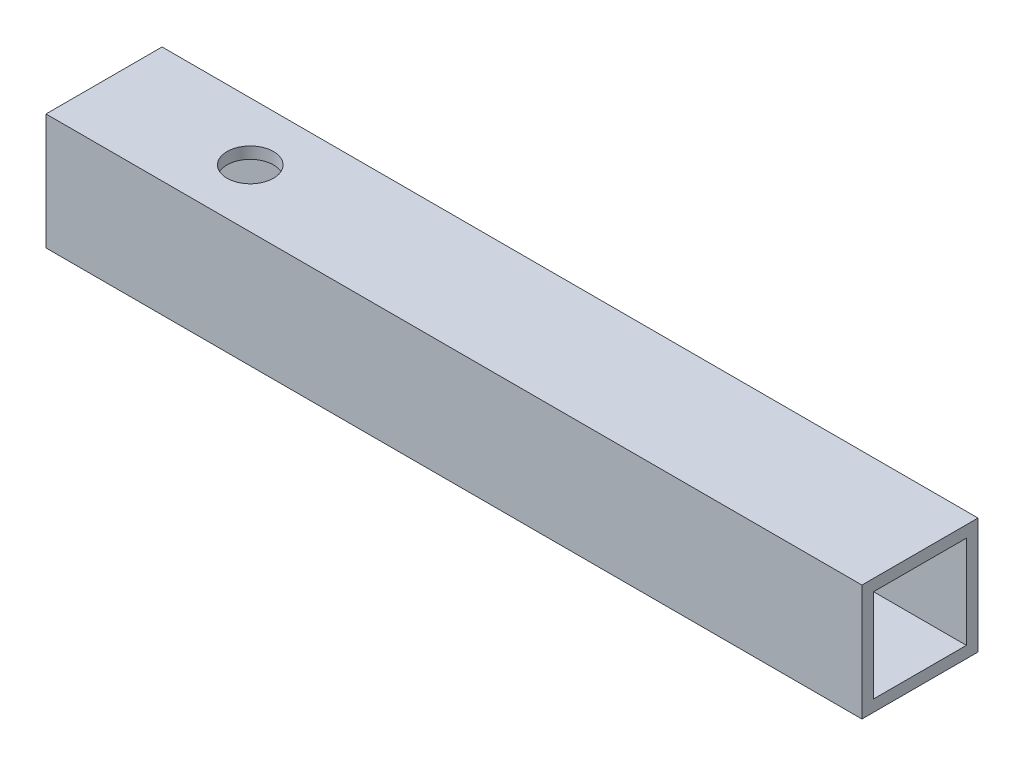
ISO-10303-21;
HEADER;
FILE_DESCRIPTION(('STEP AP214'),'2;1');
FILE_NAME('part.step','',(''),(''),'','','');
FILE_SCHEMA(('AUTOMOTIVE_DESIGN { 1 0 10303 214 1 1 1 1 }'));
ENDSEC;
DATA;
#1=APPLICATION_CONTEXT('core data for automotive mechanical design processes');
#2=APPLICATION_PROTOCOL_DEFINITION('international standard','automotive_design',2000,#1);
#3=PRODUCT_CONTEXT('',#1,'mechanical');
#4=PRODUCT('Part','Part','',(#3));
#5=PRODUCT_RELATED_PRODUCT_CATEGORY('part','',(#4));
#6=PRODUCT_DEFINITION_FORMATION('','',#4);
#7=PRODUCT_DEFINITION_CONTEXT('part definition',#1,'design');
#8=PRODUCT_DEFINITION('design','',#6,#7);
#9=PRODUCT_DEFINITION_SHAPE('','',#8);
#10=(LENGTH_UNIT() NAMED_UNIT(*) SI_UNIT(.MILLI.,.METRE.));
#11=(NAMED_UNIT(*) PLANE_ANGLE_UNIT() SI_UNIT($,.RADIAN.));
#12=(NAMED_UNIT(*) SI_UNIT($,.STERADIAN.) SOLID_ANGLE_UNIT());
#13=UNCERTAINTY_MEASURE_WITH_UNIT(LENGTH_MEASURE(1.E-05),#10,'distance_accuracy_value','');
#14=(GEOMETRIC_REPRESENTATION_CONTEXT(3) GLOBAL_UNCERTAINTY_ASSIGNED_CONTEXT((#13)) GLOBAL_UNIT_ASSIGNED_CONTEXT((#10,
#11,#12)) REPRESENTATION_CONTEXT('',''));
#15=CARTESIAN_POINT('',(0.,0.,0.));
#16=DIRECTION('',(0.,0.,1.));
#17=DIRECTION('',(1.,0.,0.));
#18=AXIS2_PLACEMENT_3D('',#15,#16,#17);
#19=CARTESIAN_POINT('',(27.9,1.984375,-1.984375));
#20=DIRECTION('',(0.,0.,1.));
#21=DIRECTION('',(0.,-1.,0.));
#22=AXIS2_PLACEMENT_3D('',#19,#20,#21);
#23=PLANE('',#22);
#24=DIRECTION('',(0.,1.,0.));
#25=VECTOR('',#24,1.);
#26=CARTESIAN_POINT('',(0.,1.984375,-1.984375));
#27=LINE('',#26,#25);
#28=CARTESIAN_POINT('',(0.,-1.984375,-1.984375));
#29=VERTEX_POINT('',#28);
#30=CARTESIAN_POINT('',(0.,1.984375,-1.984375));
#31=VERTEX_POINT('',#30);
#32=EDGE_CURVE('E137',#29,#31,#27,.T.);
#33=ORIENTED_EDGE('',*,*,#32,.T.);
#34=DIRECTION('',(-1.,0.,0.));
#35=VECTOR('',#34,1.);
#36=CARTESIAN_POINT('',(27.9,1.984375,-1.984375));
#37=LINE('',#36,#35);
#38=CARTESIAN_POINT('',(27.9,1.984375,-1.984375));
#39=VERTEX_POINT('',#38);
#40=EDGE_CURVE('E11',#39,#31,#37,.T.);
#41=ORIENTED_EDGE('',*,*,#40,.F.);
#42=DIRECTION('',(0.,1.,0.));
#43=VECTOR('',#42,1.);
#44=CARTESIAN_POINT('',(27.9,1.984375,-1.984375));
#45=LINE('',#44,#43);
#46=CARTESIAN_POINT('',(27.9,-1.984375,-1.984375));
#47=VERTEX_POINT('',#46);
#48=EDGE_CURVE('E141',#47,#39,#45,.T.);
#49=ORIENTED_EDGE('',*,*,#48,.F.);
#50=DIRECTION('',(-1.,0.,0.));
#51=VECTOR('',#50,1.);
#52=CARTESIAN_POINT('',(27.9,-1.984375,-1.984375));
#53=LINE('',#52,#51);
#54=EDGE_CURVE('E151',#47,#29,#53,.T.);
#55=ORIENTED_EDGE('',*,*,#54,.T.);
#56=EDGE_LOOP('',(#33,#41,#49,#55));
#57=FACE_BOUND('',#56,.T.);
#58=ADVANCED_FACE('F36',(#57),#23,.F.);
#59=CARTESIAN_POINT('',(27.9,1.984375,1.984375));
#60=DIRECTION('',(0.,-1.,0.));
#61=DIRECTION('',(0.,0.,-1.));
#62=AXIS2_PLACEMENT_3D('',#59,#60,#61);
#63=PLANE('',#62);
#64=CARTESIAN_POINT('',(5.,1.984375,0.));
#65=DIRECTION('',(0.,1.,0.));
#66=DIRECTION('',(0.,0.,1.));
#67=AXIS2_PLACEMENT_3D('',#64,#65,#66);
#68=CIRCLE('',#67,0.79375);
#69=CARTESIAN_POINT('',(5.,1.984375,0.79375));
#70=VERTEX_POINT('',#69);
#71=EDGE_CURVE('E228',#70,#70,#68,.T.);
#72=ORIENTED_EDGE('',*,*,#71,.F.);
#73=EDGE_LOOP('',(#72));
#74=FACE_BOUND('',#73,.T.);
#75=DIRECTION('',(0.,0.,1.));
#76=VECTOR('',#75,1.);
#77=CARTESIAN_POINT('',(0.,1.984375,1.984375));
#78=LINE('',#77,#76);
#79=CARTESIAN_POINT('',(0.,1.984375,1.984375));
#80=VERTEX_POINT('',#79);
#81=EDGE_CURVE('E154',#31,#80,#78,.T.);
#82=ORIENTED_EDGE('',*,*,#81,.T.);
#83=DIRECTION('',(-1.,0.,0.));
#84=VECTOR('',#83,1.);
#85=CARTESIAN_POINT('',(27.9,1.984375,1.984375));
#86=LINE('',#85,#84);
#87=CARTESIAN_POINT('',(27.9,1.984375,1.984375));
#88=VERTEX_POINT('',#87);
#89=EDGE_CURVE('E44',#88,#80,#86,.T.);
#90=ORIENTED_EDGE('',*,*,#89,.F.);
#91=DIRECTION('',(0.,0.,1.));
#92=VECTOR('',#91,1.);
#93=CARTESIAN_POINT('',(27.9,1.984375,1.984375));
#94=LINE('',#93,#92);
#95=EDGE_CURVE('E144',#39,#88,#94,.T.);
#96=ORIENTED_EDGE('',*,*,#95,.F.);
#97=ORIENTED_EDGE('',*,*,#40,.T.);
#98=EDGE_LOOP('',(#82,#90,#96,#97));
#99=FACE_BOUND('',#98,.T.);
#100=ADVANCED_FACE('F183',(#74,#99),#63,.F.);
#101=CARTESIAN_POINT('',(27.9,1.984375,1.984375));
#102=DIRECTION('',(0.,0.,-1.));
#103=DIRECTION('',(0.,1.,0.));
#104=AXIS2_PLACEMENT_3D('',#101,#102,#103);
#105=PLANE('',#104);
#106=DIRECTION('',(0.,-1.,0.));
#107=VECTOR('',#106,1.);
#108=CARTESIAN_POINT('',(0.,1.984375,1.984375));
#109=LINE('',#108,#107);
#110=CARTESIAN_POINT('',(0.,-1.984375,1.984375));
#111=VERTEX_POINT('',#110);
#112=EDGE_CURVE('E156',#80,#111,#109,.T.);
#113=ORIENTED_EDGE('',*,*,#112,.T.);
#114=DIRECTION('',(-1.,0.,0.));
#115=VECTOR('',#114,1.);
#116=CARTESIAN_POINT('',(27.9,-1.984375,1.984375));
#117=LINE('',#116,#115);
#118=CARTESIAN_POINT('',(27.9,-1.984375,1.984375));
#119=VERTEX_POINT('',#118);
#120=EDGE_CURVE('E161',#119,#111,#117,.T.);
#121=ORIENTED_EDGE('',*,*,#120,.F.);
#122=DIRECTION('',(0.,-1.,0.));
#123=VECTOR('',#122,1.);
#124=CARTESIAN_POINT('',(27.9,1.984375,1.984375));
#125=LINE('',#124,#123);
#126=EDGE_CURVE('E147',#88,#119,#125,.T.);
#127=ORIENTED_EDGE('',*,*,#126,.F.);
#128=ORIENTED_EDGE('',*,*,#89,.T.);
#129=EDGE_LOOP('',(#113,#121,#127,#128));
#130=FACE_BOUND('',#129,.T.);
#131=ADVANCED_FACE('F169',(#130),#105,.F.);
#132=CARTESIAN_POINT('',(27.9,-1.984375,1.984375));
#133=DIRECTION('',(0.,1.,0.));
#134=DIRECTION('',(0.,0.,1.));
#135=AXIS2_PLACEMENT_3D('',#132,#133,#134);
#136=PLANE('',#135);
#137=CARTESIAN_POINT('',(5.,-1.984375,0.));
#138=DIRECTION('',(0.,1.,0.));
#139=DIRECTION('',(0.,0.,1.));
#140=AXIS2_PLACEMENT_3D('',#137,#138,#139);
#141=CIRCLE('',#140,0.79375);
#142=CARTESIAN_POINT('',(5.,-1.984375,0.79375));
#143=VERTEX_POINT('',#142);
#144=EDGE_CURVE('E125',#143,#143,#141,.T.);
#145=ORIENTED_EDGE('',*,*,#144,.T.);
#146=EDGE_LOOP('',(#145));
#147=FACE_BOUND('',#146,.T.);
#148=DIRECTION('',(0.,0.,-1.));
#149=VECTOR('',#148,1.);
#150=CARTESIAN_POINT('',(0.,-1.984375,1.984375));
#151=LINE('',#150,#149);
#152=EDGE_CURVE('E145',#111,#29,#151,.T.);
#153=ORIENTED_EDGE('',*,*,#152,.T.);
#154=ORIENTED_EDGE('',*,*,#54,.F.);
#155=DIRECTION('',(0.,0.,-1.));
#156=VECTOR('',#155,1.);
#157=CARTESIAN_POINT('',(27.9,-1.984375,1.984375));
#158=LINE('',#157,#156);
#159=EDGE_CURVE('E149',#119,#47,#158,.T.);
#160=ORIENTED_EDGE('',*,*,#159,.F.);
#161=ORIENTED_EDGE('',*,*,#120,.T.);
#162=EDGE_LOOP('',(#153,#154,#160,#161));
#163=FACE_BOUND('',#162,.T.);
#164=ADVANCED_FACE('F178',(#147,#163),#136,.F.);
#165=CARTESIAN_POINT('',(27.9,0.,0.));
#166=DIRECTION('',(1.,0.,0.));
#167=DIRECTION('',(0.,0.,-1.));
#168=AXIS2_PLACEMENT_3D('',#165,#166,#167);
#169=PLANE('',#168);
#170=DIRECTION('',(0.,1.,0.));
#171=VECTOR('',#170,1.);
#172=CARTESIAN_POINT('',(27.9,1.5875,1.5875));
#173=LINE('',#172,#171);
#174=CARTESIAN_POINT('',(27.9,-1.5875,1.5875));
#175=VERTEX_POINT('',#174);
#176=CARTESIAN_POINT('',(27.9,1.5875,1.5875));
#177=VERTEX_POINT('',#176);
#178=EDGE_CURVE('E103',#175,#177,#173,.T.);
#179=ORIENTED_EDGE('',*,*,#178,.T.);
#180=DIRECTION('',(0.,0.,-1.));
#181=VECTOR('',#180,1.);
#182=CARTESIAN_POINT('',(27.9,1.5875,-1.5875));
#183=LINE('',#182,#181);
#184=CARTESIAN_POINT('',(27.9,1.5875,-1.5875));
#185=VERTEX_POINT('',#184);
#186=EDGE_CURVE('E112',#177,#185,#183,.T.);
#187=ORIENTED_EDGE('',*,*,#186,.T.);
#188=DIRECTION('',(0.,-1.,0.));
#189=VECTOR('',#188,1.);
#190=CARTESIAN_POINT('',(27.9,1.5875,-1.5875));
#191=LINE('',#190,#189);
#192=CARTESIAN_POINT('',(27.9,-1.5875,-1.5875));
#193=VERTEX_POINT('',#192);
#194=EDGE_CURVE('E51',#185,#193,#191,.T.);
#195=ORIENTED_EDGE('',*,*,#194,.T.);
#196=DIRECTION('',(0.,0.,1.));
#197=VECTOR('',#196,1.);
#198=CARTESIAN_POINT('',(27.9,-1.5875,-1.5875));
#199=LINE('',#198,#197);
#200=EDGE_CURVE('E109',#193,#175,#199,.T.);
#201=ORIENTED_EDGE('',*,*,#200,.T.);
#202=EDGE_LOOP('',(#179,#187,#195,#201));
#203=FACE_BOUND('',#202,.T.);
#204=ORIENTED_EDGE('',*,*,#48,.T.);
#205=ORIENTED_EDGE('',*,*,#95,.T.);
#206=ORIENTED_EDGE('',*,*,#126,.T.);
#207=ORIENTED_EDGE('',*,*,#159,.T.);
#208=EDGE_LOOP('',(#204,#205,#206,#207));
#209=FACE_BOUND('',#208,.T.);
#210=ADVANCED_FACE('F116',(#203,#209),#169,.T.);
#211=CARTESIAN_POINT('',(0.,0.,0.));
#212=DIRECTION('',(1.,0.,0.));
#213=DIRECTION('',(0.,0.,-1.));
#214=AXIS2_PLACEMENT_3D('',#211,#212,#213);
#215=PLANE('',#214);
#216=DIRECTION('',(0.,0.,-1.));
#217=VECTOR('',#216,1.);
#218=CARTESIAN_POINT('',(0.,1.5875,-1.5875));
#219=LINE('',#218,#217);
#220=CARTESIAN_POINT('',(0.,1.5875,1.5875));
#221=VERTEX_POINT('',#220);
#222=CARTESIAN_POINT('',(0.,1.5875,-1.5875));
#223=VERTEX_POINT('',#222);
#224=EDGE_CURVE('E131',#221,#223,#219,.T.);
#225=ORIENTED_EDGE('',*,*,#224,.F.);
#226=DIRECTION('',(0.,1.,0.));
#227=VECTOR('',#226,1.);
#228=CARTESIAN_POINT('',(0.,1.5875,1.5875));
#229=LINE('',#228,#227);
#230=CARTESIAN_POINT('',(0.,-1.5875,1.5875));
#231=VERTEX_POINT('',#230);
#232=EDGE_CURVE('E59',#231,#221,#229,.T.);
#233=ORIENTED_EDGE('',*,*,#232,.F.);
#234=DIRECTION('',(0.,0.,1.));
#235=VECTOR('',#234,1.);
#236=CARTESIAN_POINT('',(0.,-1.5875,-1.5875));
#237=LINE('',#236,#235);
#238=CARTESIAN_POINT('',(0.,-1.5875,-1.5875));
#239=VERTEX_POINT('',#238);
#240=EDGE_CURVE('E119',#239,#231,#237,.T.);
#241=ORIENTED_EDGE('',*,*,#240,.F.);
#242=DIRECTION('',(0.,-1.,0.));
#243=VECTOR('',#242,1.);
#244=CARTESIAN_POINT('',(0.,1.5875,-1.5875));
#245=LINE('',#244,#243);
#246=EDGE_CURVE('E122',#223,#239,#245,.T.);
#247=ORIENTED_EDGE('',*,*,#246,.F.);
#248=EDGE_LOOP('',(#225,#233,#241,#247));
#249=FACE_BOUND('',#248,.T.);
#250=ORIENTED_EDGE('',*,*,#32,.F.);
#251=ORIENTED_EDGE('',*,*,#152,.F.);
#252=ORIENTED_EDGE('',*,*,#112,.F.);
#253=ORIENTED_EDGE('',*,*,#81,.F.);
#254=EDGE_LOOP('',(#250,#251,#252,#253));
#255=FACE_BOUND('',#254,.T.);
#256=ADVANCED_FACE('F175',(#249,#255),#215,.F.);
#257=CARTESIAN_POINT('',(27.9,1.5875,1.5875));
#258=DIRECTION('',(0.,0.,1.));
#259=DIRECTION('',(0.,-1.,0.));
#260=AXIS2_PLACEMENT_3D('',#257,#258,#259);
#261=PLANE('',#260);
#262=ORIENTED_EDGE('',*,*,#232,.T.);
#263=DIRECTION('',(-1.,0.,0.));
#264=VECTOR('',#263,1.);
#265=CARTESIAN_POINT('',(27.9,1.5875,1.5875));
#266=LINE('',#265,#264);
#267=EDGE_CURVE('E99',#177,#221,#266,.T.);
#268=ORIENTED_EDGE('',*,*,#267,.F.);
#269=ORIENTED_EDGE('',*,*,#178,.F.);
#270=DIRECTION('',(-1.,0.,0.));
#271=VECTOR('',#270,1.);
#272=CARTESIAN_POINT('',(27.9,-1.5875,1.5875));
#273=LINE('',#272,#271);
#274=EDGE_CURVE('E135',#175,#231,#273,.T.);
#275=ORIENTED_EDGE('',*,*,#274,.T.);
#276=EDGE_LOOP('',(#262,#268,#269,#275));
#277=FACE_BOUND('',#276,.T.);
#278=ADVANCED_FACE('F101',(#277),#261,.F.);
#279=CARTESIAN_POINT('',(27.9,-1.5875,-1.5875));
#280=DIRECTION('',(0.,-1.,0.));
#281=DIRECTION('',(0.,0.,-1.));
#282=AXIS2_PLACEMENT_3D('',#279,#280,#281);
#283=PLANE('',#282);
#284=CARTESIAN_POINT('',(5.,-1.5875,0.));
#285=DIRECTION('',(0.,-1.,0.));
#286=DIRECTION('',(0.,0.,-1.));
#287=AXIS2_PLACEMENT_3D('',#284,#285,#286);
#288=CIRCLE('',#287,0.79375);
#289=CARTESIAN_POINT('',(5.,-1.5875,-0.79375));
#290=VERTEX_POINT('',#289);
#291=EDGE_CURVE('E224',#290,#290,#288,.T.);
#292=ORIENTED_EDGE('',*,*,#291,.T.);
#293=EDGE_LOOP('',(#292));
#294=FACE_BOUND('',#293,.T.);
#295=ORIENTED_EDGE('',*,*,#240,.T.);
#296=ORIENTED_EDGE('',*,*,#274,.F.);
#297=ORIENTED_EDGE('',*,*,#200,.F.);
#298=DIRECTION('',(-1.,0.,0.));
#299=VECTOR('',#298,1.);
#300=CARTESIAN_POINT('',(27.9,-1.5875,-1.5875));
#301=LINE('',#300,#299);
#302=EDGE_CURVE('E138',#193,#239,#301,.T.);
#303=ORIENTED_EDGE('',*,*,#302,.T.);
#304=EDGE_LOOP('',(#295,#296,#297,#303));
#305=FACE_BOUND('',#304,.T.);
#306=ADVANCED_FACE('F203',(#294,#305),#283,.F.);
#307=CARTESIAN_POINT('',(27.9,1.5875,-1.5875));
#308=DIRECTION('',(0.,0.,-1.));
#309=DIRECTION('',(0.,1.,0.));
#310=AXIS2_PLACEMENT_3D('',#307,#308,#309);
#311=PLANE('',#310);
#312=ORIENTED_EDGE('',*,*,#246,.T.);
#313=ORIENTED_EDGE('',*,*,#302,.F.);
#314=ORIENTED_EDGE('',*,*,#194,.F.);
#315=DIRECTION('',(-1.,0.,0.));
#316=VECTOR('',#315,1.);
#317=CARTESIAN_POINT('',(27.9,1.5875,-1.5875));
#318=LINE('',#317,#316);
#319=EDGE_CURVE('E108',#185,#223,#318,.T.);
#320=ORIENTED_EDGE('',*,*,#319,.T.);
#321=EDGE_LOOP('',(#312,#313,#314,#320));
#322=FACE_BOUND('',#321,.T.);
#323=ADVANCED_FACE('F207',(#322),#311,.F.);
#324=CARTESIAN_POINT('',(27.9,1.5875,-1.5875));
#325=DIRECTION('',(0.,1.,0.));
#326=DIRECTION('',(0.,0.,1.));
#327=AXIS2_PLACEMENT_3D('',#324,#325,#326);
#328=PLANE('',#327);
#329=CARTESIAN_POINT('',(5.,1.5875,0.));
#330=DIRECTION('',(0.,1.,0.));
#331=DIRECTION('',(0.,0.,1.));
#332=AXIS2_PLACEMENT_3D('',#329,#330,#331);
#333=CIRCLE('',#332,0.79375);
#334=CARTESIAN_POINT('',(5.,1.5875,0.79375));
#335=VERTEX_POINT('',#334);
#336=EDGE_CURVE('E39',#335,#335,#333,.T.);
#337=ORIENTED_EDGE('',*,*,#336,.T.);
#338=EDGE_LOOP('',(#337));
#339=FACE_BOUND('',#338,.T.);
#340=ORIENTED_EDGE('',*,*,#224,.T.);
#341=ORIENTED_EDGE('',*,*,#319,.F.);
#342=ORIENTED_EDGE('',*,*,#186,.F.);
#343=ORIENTED_EDGE('',*,*,#267,.T.);
#344=EDGE_LOOP('',(#340,#341,#342,#343));
#345=FACE_BOUND('',#344,.T.);
#346=ADVANCED_FACE('F113',(#339,#345),#328,.F.);
#347=CARTESIAN_POINT('',(5.,-8.01562499999999,0.));
#348=DIRECTION('',(0.,1.,0.));
#349=DIRECTION('',(0.,0.,1.));
#350=AXIS2_PLACEMENT_3D('',#347,#348,#349);
#351=CYLINDRICAL_SURFACE('',#350,0.79375);
#352=ORIENTED_EDGE('',*,*,#71,.T.);
#353=EDGE_LOOP('',(#352));
#354=FACE_BOUND('',#353,.T.);
#355=ORIENTED_EDGE('',*,*,#336,.F.);
#356=EDGE_LOOP('',(#355));
#357=FACE_BOUND('',#356,.T.);
#358=ADVANCED_FACE('F206',(#354,#357),#351,.F.);
#359=ORIENTED_EDGE('',*,*,#291,.F.);
#360=EDGE_LOOP('',(#359));
#361=FACE_BOUND('',#360,.T.);
#362=ORIENTED_EDGE('',*,*,#144,.F.);
#363=EDGE_LOOP('',(#362));
#364=FACE_BOUND('',#363,.T.);
#365=ADVANCED_FACE('F214',(#361,#364),#351,.F.);
#366=CLOSED_SHELL('',(#58,#100,#131,#164,#210,#256,#278,#306,#323,#346,#358,#365));
#367=MANIFOLD_SOLID_BREP('B2',#366);
#368=ADVANCED_BREP_SHAPE_REPRESENTATION('',(#18,#367),#14);
#369=SHAPE_DEFINITION_REPRESENTATION(#9,#368);
ENDSEC;
END-ISO-10303-21;
